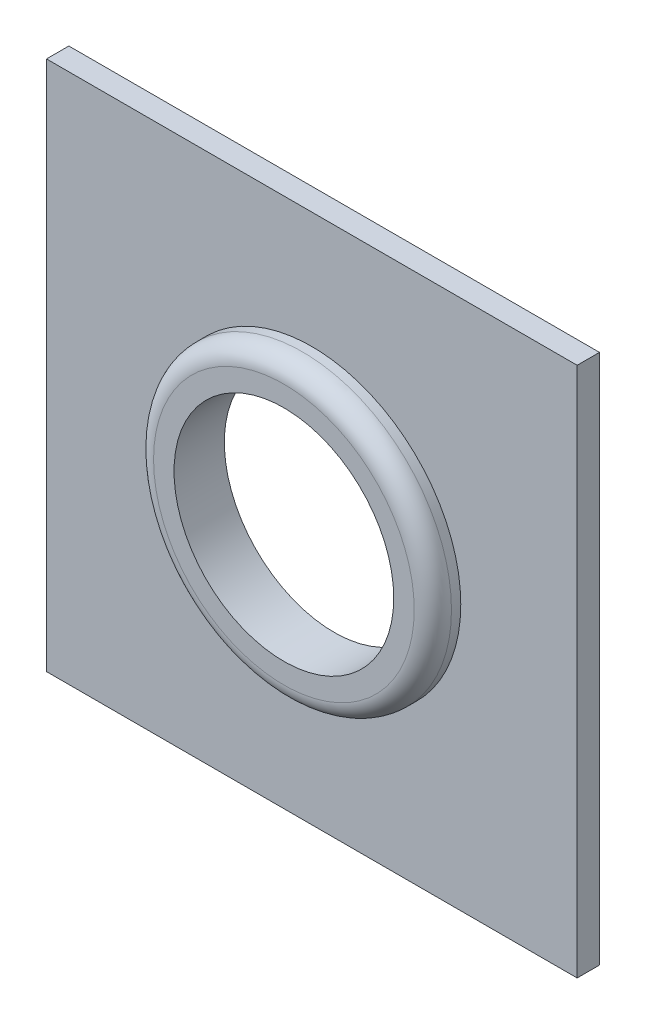
ISO-10303-21;
HEADER;
FILE_DESCRIPTION(('STEP AP214'),'2;1');
FILE_NAME('part.step','',(''),(''),'','','');
FILE_SCHEMA(('AUTOMOTIVE_DESIGN { 1 0 10303 214 1 1 1 1 }'));
ENDSEC;
DATA;
#1=APPLICATION_CONTEXT('core data for automotive mechanical design processes');
#2=APPLICATION_PROTOCOL_DEFINITION('international standard','automotive_design',2000,#1);
#3=PRODUCT_CONTEXT('',#1,'mechanical');
#4=PRODUCT('Part','Part','',(#3));
#5=PRODUCT_RELATED_PRODUCT_CATEGORY('part','',(#4));
#6=PRODUCT_DEFINITION_FORMATION('','',#4);
#7=PRODUCT_DEFINITION_CONTEXT('part definition',#1,'design');
#8=PRODUCT_DEFINITION('design','',#6,#7);
#9=PRODUCT_DEFINITION_SHAPE('','',#8);
#10=(LENGTH_UNIT() NAMED_UNIT(*) SI_UNIT(.MILLI.,.METRE.));
#11=(NAMED_UNIT(*) PLANE_ANGLE_UNIT() SI_UNIT($,.RADIAN.));
#12=(NAMED_UNIT(*) SI_UNIT($,.STERADIAN.) SOLID_ANGLE_UNIT());
#13=UNCERTAINTY_MEASURE_WITH_UNIT(LENGTH_MEASURE(1.E-05),#10,'distance_accuracy_value','');
#14=(GEOMETRIC_REPRESENTATION_CONTEXT(3) GLOBAL_UNCERTAINTY_ASSIGNED_CONTEXT((#13)) GLOBAL_UNIT_ASSIGNED_CONTEXT((#10,
#11,#12)) REPRESENTATION_CONTEXT('',''));
#15=CARTESIAN_POINT('',(0.,0.,0.));
#16=DIRECTION('',(0.,0.,1.));
#17=DIRECTION('',(1.,0.,0.));
#18=AXIS2_PLACEMENT_3D('',#15,#16,#17);
#19=CARTESIAN_POINT('',(0.,-14.25,1.2));
#20=DIRECTION('',(0.,1.,0.));
#21=DIRECTION('',(0.,0.,1.));
#22=AXIS2_PLACEMENT_3D('',#19,#20,#21);
#23=PLANE('',#22);
#24=DIRECTION('',(1.,0.,0.));
#25=VECTOR('',#24,1.);
#26=CARTESIAN_POINT('',(0.,-14.25,0.));
#27=LINE('',#26,#25);
#28=CARTESIAN_POINT('',(-14.25,-14.25,0.));
#29=VERTEX_POINT('',#28);
#30=CARTESIAN_POINT('',(14.25,-14.25,0.));
#31=VERTEX_POINT('',#30);
#32=EDGE_CURVE('E106',#29,#31,#27,.T.);
#33=ORIENTED_EDGE('',*,*,#32,.T.);
#34=DIRECTION('',(0.,0.,-1.));
#35=VECTOR('',#34,1.);
#36=CARTESIAN_POINT('',(14.25,-14.25,1.2));
#37=LINE('',#36,#35);
#38=CARTESIAN_POINT('',(14.25,-14.25,1.2));
#39=VERTEX_POINT('',#38);
#40=EDGE_CURVE('E95',#39,#31,#37,.T.);
#41=ORIENTED_EDGE('',*,*,#40,.F.);
#42=DIRECTION('',(1.,0.,0.));
#43=VECTOR('',#42,1.);
#44=CARTESIAN_POINT('',(0.,-14.25,1.2));
#45=LINE('',#44,#43);
#46=CARTESIAN_POINT('',(-14.25,-14.25,1.2));
#47=VERTEX_POINT('',#46);
#48=EDGE_CURVE('E86',#47,#39,#45,.T.);
#49=ORIENTED_EDGE('',*,*,#48,.F.);
#50=DIRECTION('',(0.,0.,-1.));
#51=VECTOR('',#50,1.);
#52=CARTESIAN_POINT('',(-14.25,-14.25,1.2));
#53=LINE('',#52,#51);
#54=EDGE_CURVE('E52',#47,#29,#53,.T.);
#55=ORIENTED_EDGE('',*,*,#54,.T.);
#56=EDGE_LOOP('',(#33,#41,#49,#55));
#57=FACE_BOUND('',#56,.T.);
#58=ADVANCED_FACE('F35',(#57),#23,.F.);
#59=CARTESIAN_POINT('',(14.25,0.,1.2));
#60=DIRECTION('',(-1.,0.,0.));
#61=DIRECTION('',(0.,0.,1.));
#62=AXIS2_PLACEMENT_3D('',#59,#60,#61);
#63=PLANE('',#62);
#64=DIRECTION('',(0.,1.,0.));
#65=VECTOR('',#64,1.);
#66=CARTESIAN_POINT('',(14.25,0.,0.));
#67=LINE('',#66,#65);
#68=CARTESIAN_POINT('',(14.25,14.25,0.));
#69=VERTEX_POINT('',#68);
#70=EDGE_CURVE('E92',#31,#69,#67,.T.);
#71=ORIENTED_EDGE('',*,*,#70,.T.);
#72=DIRECTION('',(0.,0.,-1.));
#73=VECTOR('',#72,1.);
#74=CARTESIAN_POINT('',(14.25,14.25,1.2));
#75=LINE('',#74,#73);
#76=CARTESIAN_POINT('',(14.25,14.25,1.2));
#77=VERTEX_POINT('',#76);
#78=EDGE_CURVE('E90',#77,#69,#75,.T.);
#79=ORIENTED_EDGE('',*,*,#78,.F.);
#80=DIRECTION('',(0.,1.,0.));
#81=VECTOR('',#80,1.);
#82=CARTESIAN_POINT('',(14.25,0.,1.2));
#83=LINE('',#82,#81);
#84=EDGE_CURVE('E78',#39,#77,#83,.T.);
#85=ORIENTED_EDGE('',*,*,#84,.F.);
#86=ORIENTED_EDGE('',*,*,#40,.T.);
#87=EDGE_LOOP('',(#71,#79,#85,#86));
#88=FACE_BOUND('',#87,.T.);
#89=ADVANCED_FACE('F91',(#88),#63,.F.);
#90=CARTESIAN_POINT('',(0.,14.25,1.2));
#91=DIRECTION('',(0.,1.,0.));
#92=DIRECTION('',(0.,0.,1.));
#93=AXIS2_PLACEMENT_3D('',#90,#91,#92);
#94=PLANE('',#93);
#95=DIRECTION('',(1.,0.,0.));
#96=VECTOR('',#95,1.);
#97=CARTESIAN_POINT('',(0.,14.25,0.));
#98=LINE('',#97,#96);
#99=CARTESIAN_POINT('',(-14.25,14.25,0.));
#100=VERTEX_POINT('',#99);
#101=EDGE_CURVE('E110',#100,#69,#98,.T.);
#102=ORIENTED_EDGE('',*,*,#101,.F.);
#103=DIRECTION('',(0.,0.,-1.));
#104=VECTOR('',#103,1.);
#105=CARTESIAN_POINT('',(-14.25,14.25,1.2));
#106=LINE('',#105,#104);
#107=CARTESIAN_POINT('',(-14.25,14.25,1.2));
#108=VERTEX_POINT('',#107);
#109=EDGE_CURVE('E66',#108,#100,#106,.T.);
#110=ORIENTED_EDGE('',*,*,#109,.F.);
#111=DIRECTION('',(1.,0.,0.));
#112=VECTOR('',#111,1.);
#113=CARTESIAN_POINT('',(0.,14.25,1.2));
#114=LINE('',#113,#112);
#115=EDGE_CURVE('E85',#108,#77,#114,.T.);
#116=ORIENTED_EDGE('',*,*,#115,.T.);
#117=ORIENTED_EDGE('',*,*,#78,.T.);
#118=EDGE_LOOP('',(#102,#110,#116,#117));
#119=FACE_BOUND('',#118,.T.);
#120=ADVANCED_FACE('F97',(#119),#94,.T.);
#121=CARTESIAN_POINT('',(0.,0.,1.2));
#122=DIRECTION('',(0.,0.,-1.));
#123=DIRECTION('',(-1.,0.,0.));
#124=AXIS2_PLACEMENT_3D('',#121,#122,#123);
#125=CYLINDRICAL_SURFACE('',#124,5.9);
#126=CARTESIAN_POINT('',(0.,0.,0.));
#127=DIRECTION('',(0.,0.,1.));
#128=DIRECTION('',(1.,0.,0.));
#129=AXIS2_PLACEMENT_3D('',#126,#127,#128);
#130=CIRCLE('',#129,5.9);
#131=CARTESIAN_POINT('',(5.9,0.,0.));
#132=VERTEX_POINT('',#131);
#133=EDGE_CURVE('E103',#132,#132,#130,.T.);
#134=ORIENTED_EDGE('',*,*,#133,.F.);
#135=EDGE_LOOP('',(#134));
#136=FACE_BOUND('',#135,.T.);
#137=CARTESIAN_POINT('',(0.,0.,2.7));
#138=DIRECTION('',(0.,0.,1.));
#139=DIRECTION('',(1.,0.,0.));
#140=AXIS2_PLACEMENT_3D('',#137,#138,#139);
#141=CIRCLE('',#140,5.9);
#142=CARTESIAN_POINT('',(5.9,0.,2.7));
#143=VERTEX_POINT('',#142);
#144=EDGE_CURVE('E151',#143,#143,#141,.T.);
#145=ORIENTED_EDGE('',*,*,#144,.T.);
#146=EDGE_LOOP('',(#145));
#147=FACE_BOUND('',#146,.T.);
#148=ADVANCED_FACE('F138',(#136,#147),#125,.F.);
#149=CARTESIAN_POINT('',(-14.25,0.,1.2));
#150=DIRECTION('',(-1.,0.,0.));
#151=DIRECTION('',(0.,0.,1.));
#152=AXIS2_PLACEMENT_3D('',#149,#150,#151);
#153=PLANE('',#152);
#154=DIRECTION('',(0.,1.,0.));
#155=VECTOR('',#154,1.);
#156=CARTESIAN_POINT('',(-14.25,0.,0.));
#157=LINE('',#156,#155);
#158=EDGE_CURVE('E112',#29,#100,#157,.T.);
#159=ORIENTED_EDGE('',*,*,#158,.F.);
#160=ORIENTED_EDGE('',*,*,#54,.F.);
#161=DIRECTION('',(0.,1.,0.));
#162=VECTOR('',#161,1.);
#163=CARTESIAN_POINT('',(-14.25,0.,1.2));
#164=LINE('',#163,#162);
#165=EDGE_CURVE('E98',#47,#108,#164,.T.);
#166=ORIENTED_EDGE('',*,*,#165,.T.);
#167=ORIENTED_EDGE('',*,*,#109,.T.);
#168=EDGE_LOOP('',(#159,#160,#166,#167));
#169=FACE_BOUND('',#168,.T.);
#170=ADVANCED_FACE('F140',(#169),#153,.T.);
#171=CARTESIAN_POINT('',(0.,0.,1.2));
#172=DIRECTION('',(0.,0.,1.));
#173=DIRECTION('',(1.,0.,0.));
#174=AXIS2_PLACEMENT_3D('',#171,#172,#173);
#175=PLANE('',#174);
#176=CARTESIAN_POINT('',(0.,0.,1.2));
#177=DIRECTION('',(0.,0.,1.));
#178=DIRECTION('',(1.,0.,0.));
#179=AXIS2_PLACEMENT_3D('',#176,#177,#178);
#180=CIRCLE('',#179,8.);
#181=CARTESIAN_POINT('',(8.,0.,1.2));
#182=VERTEX_POINT('',#181);
#183=EDGE_CURVE('E107',#182,#182,#180,.F.);
#184=ORIENTED_EDGE('',*,*,#183,.T.);
#185=EDGE_LOOP('',(#184));
#186=FACE_BOUND('',#185,.T.);
#187=ORIENTED_EDGE('',*,*,#48,.T.);
#188=ORIENTED_EDGE('',*,*,#84,.T.);
#189=ORIENTED_EDGE('',*,*,#115,.F.);
#190=ORIENTED_EDGE('',*,*,#165,.F.);
#191=EDGE_LOOP('',(#187,#188,#189,#190));
#192=FACE_BOUND('',#191,.T.);
#193=ADVANCED_FACE('F82',(#186,#192),#175,.T.);
#194=CARTESIAN_POINT('',(0.,0.,0.));
#195=DIRECTION('',(0.,0.,1.));
#196=DIRECTION('',(1.,0.,0.));
#197=AXIS2_PLACEMENT_3D('',#194,#195,#196);
#198=PLANE('',#197);
#199=ORIENTED_EDGE('',*,*,#32,.F.);
#200=ORIENTED_EDGE('',*,*,#158,.T.);
#201=ORIENTED_EDGE('',*,*,#101,.T.);
#202=ORIENTED_EDGE('',*,*,#70,.F.);
#203=EDGE_LOOP('',(#199,#200,#201,#202));
#204=FACE_BOUND('',#203,.T.);
#205=ORIENTED_EDGE('',*,*,#133,.T.);
#206=EDGE_LOOP('',(#205));
#207=FACE_BOUND('',#206,.T.);
#208=ADVANCED_FACE('F159',(#204,#207),#198,.F.);
#209=CARTESIAN_POINT('',(0.,0.,2.7));
#210=DIRECTION('',(0.,0.,-1.));
#211=DIRECTION('',(-1.,0.,0.));
#212=AXIS2_PLACEMENT_3D('',#209,#210,#211);
#213=CYLINDRICAL_SURFACE('',#212,8.);
#214=CARTESIAN_POINT('',(0.,0.,1.7));
#215=DIRECTION('',(0.,0.,1.));
#216=DIRECTION('',(1.,0.,0.));
#217=AXIS2_PLACEMENT_3D('',#214,#215,#216);
#218=CIRCLE('',#217,8.);
#219=CARTESIAN_POINT('',(8.,0.,1.7));
#220=VERTEX_POINT('',#219);
#221=EDGE_CURVE('E11',#220,#220,#218,.F.);
#222=ORIENTED_EDGE('',*,*,#221,.T.);
#223=EDGE_LOOP('',(#222));
#224=FACE_BOUND('',#223,.T.);
#225=ORIENTED_EDGE('',*,*,#183,.F.);
#226=EDGE_LOOP('',(#225));
#227=FACE_BOUND('',#226,.T.);
#228=ADVANCED_FACE('F128',(#224,#227),#213,.T.);
#229=CARTESIAN_POINT('',(0.,0.,2.7));
#230=DIRECTION('',(0.,0.,1.));
#231=DIRECTION('',(1.,0.,0.));
#232=AXIS2_PLACEMENT_3D('',#229,#230,#231);
#233=PLANE('',#232);
#234=CARTESIAN_POINT('',(0.,0.,2.7));
#235=DIRECTION('',(0.,0.,1.));
#236=DIRECTION('',(1.,0.,0.));
#237=AXIS2_PLACEMENT_3D('',#234,#235,#236);
#238=CIRCLE('',#237,7.);
#239=CARTESIAN_POINT('',(7.,0.,2.7));
#240=VERTEX_POINT('',#239);
#241=EDGE_CURVE('E44',#240,#240,#238,.T.);
#242=ORIENTED_EDGE('',*,*,#241,.T.);
#243=EDGE_LOOP('',(#242));
#244=FACE_BOUND('',#243,.T.);
#245=ORIENTED_EDGE('',*,*,#144,.F.);
#246=EDGE_LOOP('',(#245));
#247=FACE_BOUND('',#246,.T.);
#248=ADVANCED_FACE('F120',(#244,#247),#233,.T.);
#249=CARTESIAN_POINT('',(0.,0.,1.7));
#250=DIRECTION('',(0.,0.,1.));
#251=DIRECTION('',(1.,0.,0.));
#252=AXIS2_PLACEMENT_3D('',#249,#250,#251);
#253=TOROIDAL_SURFACE('',#252,7.,1.);
#254=ORIENTED_EDGE('',*,*,#221,.F.);
#255=EDGE_LOOP('',(#254));
#256=FACE_BOUND('',#255,.T.);
#257=ORIENTED_EDGE('',*,*,#241,.F.);
#258=EDGE_LOOP('',(#257));
#259=FACE_BOUND('',#258,.T.);
#260=ADVANCED_FACE('F37',(#256,#259),#253,.T.);
#261=CLOSED_SHELL('',(#58,#89,#120,#148,#170,#193,#208,#228,#248,#260));
#262=MANIFOLD_SOLID_BREP('B2',#261);
#263=ADVANCED_BREP_SHAPE_REPRESENTATION('',(#18,#262),#14);
#264=SHAPE_DEFINITION_REPRESENTATION(#9,#263);
ENDSEC;
END-ISO-10303-21;
